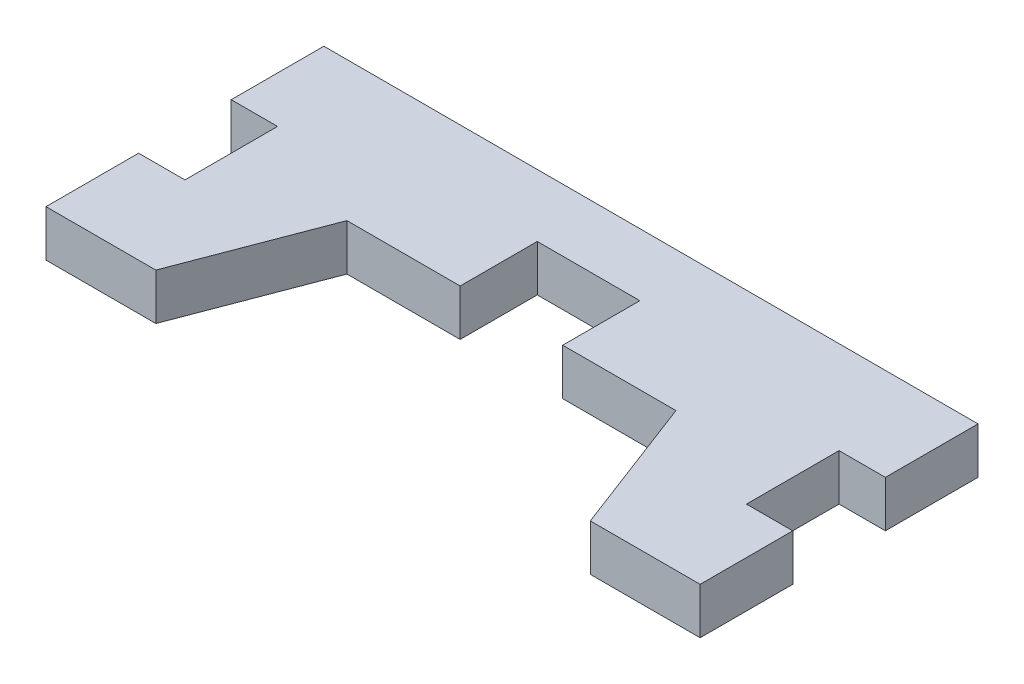
ISO-10303-21;
HEADER;
FILE_DESCRIPTION(('STEP AP214'),'2;1');
FILE_NAME('part.step','',(''),(''),'','','');
FILE_SCHEMA(('AUTOMOTIVE_DESIGN { 1 0 10303 214 1 1 1 1 }'));
ENDSEC;
DATA;
#1=APPLICATION_CONTEXT('core data for automotive mechanical design processes');
#2=APPLICATION_PROTOCOL_DEFINITION('international standard','automotive_design',2000,#1);
#3=PRODUCT_CONTEXT('',#1,'mechanical');
#4=PRODUCT('Part','Part','',(#3));
#5=PRODUCT_RELATED_PRODUCT_CATEGORY('part','',(#4));
#6=PRODUCT_DEFINITION_FORMATION('','',#4);
#7=PRODUCT_DEFINITION_CONTEXT('part definition',#1,'design');
#8=PRODUCT_DEFINITION('design','',#6,#7);
#9=PRODUCT_DEFINITION_SHAPE('','',#8);
#10=(LENGTH_UNIT() NAMED_UNIT(*) SI_UNIT(.MILLI.,.METRE.));
#11=(NAMED_UNIT(*) PLANE_ANGLE_UNIT() SI_UNIT($,.RADIAN.));
#12=(NAMED_UNIT(*) SI_UNIT($,.STERADIAN.) SOLID_ANGLE_UNIT());
#13=UNCERTAINTY_MEASURE_WITH_UNIT(LENGTH_MEASURE(1.E-05),#10,'distance_accuracy_value','');
#14=(GEOMETRIC_REPRESENTATION_CONTEXT(3) GLOBAL_UNCERTAINTY_ASSIGNED_CONTEXT((#13)) GLOBAL_UNIT_ASSIGNED_CONTEXT((#10,
#11,#12)) REPRESENTATION_CONTEXT('',''));
#15=CARTESIAN_POINT('',(0.,0.,0.));
#16=DIRECTION('',(0.,0.,1.));
#17=DIRECTION('',(1.,0.,0.));
#18=AXIS2_PLACEMENT_3D('',#15,#16,#17);
#19=CARTESIAN_POINT('',(25.5388964978911,6.,-1.12299862126056));
#20=DIRECTION('',(-0.934469694390437,0.,-0.356042680399194));
#21=DIRECTION('',(-0.356042680399194,0.,0.934469694390437));
#22=AXIS2_PLACEMENT_3D('',#19,#20,#21);
#23=PLANE('',#22);
#24=DIRECTION('',(0.356042680399194,0.,-0.934469694390437));
#25=VECTOR('',#24,1.);
#26=CARTESIAN_POINT('',(25.5388964978911,0.,-1.12299862126056));
#27=LINE('',#26,#25);
#28=CARTESIAN_POINT('',(18.7086114695798,0.,16.803768910793));
#29=VERTEX_POINT('',#28);
#30=CARTESIAN_POINT('',(25.5388964978911,0.,-1.12299862126056));
#31=VERTEX_POINT('',#30);
#32=EDGE_CURVE('E201',#29,#31,#27,.T.);
#33=ORIENTED_EDGE('',*,*,#32,.T.);
#34=DIRECTION('',(0.,-1.,0.));
#35=VECTOR('',#34,1.);
#36=CARTESIAN_POINT('',(25.5388964978911,6.,-1.12299862126056));
#37=LINE('',#36,#35);
#38=CARTESIAN_POINT('',(25.5388964978911,6.,-1.12299862126056));
#39=VERTEX_POINT('',#38);
#40=EDGE_CURVE('E11',#39,#31,#37,.T.);
#41=ORIENTED_EDGE('',*,*,#40,.F.);
#42=DIRECTION('',(0.356042680399194,0.,-0.934469694390437));
#43=VECTOR('',#42,1.);
#44=CARTESIAN_POINT('',(25.5388964978911,6.,-1.12299862126056));
#45=LINE('',#44,#43);
#46=CARTESIAN_POINT('',(18.7086114695798,6.,16.803768910793));
#47=VERTEX_POINT('',#46);
#48=EDGE_CURVE('E239',#47,#39,#45,.T.);
#49=ORIENTED_EDGE('',*,*,#48,.F.);
#50=DIRECTION('',(0.,-1.,0.));
#51=VECTOR('',#50,1.);
#52=CARTESIAN_POINT('',(18.7086114695798,6.,16.803768910793));
#53=LINE('',#52,#51);
#54=EDGE_CURVE('E197',#47,#29,#53,.T.);
#55=ORIENTED_EDGE('',*,*,#54,.T.);
#56=EDGE_LOOP('',(#33,#41,#49,#55));
#57=FACE_BOUND('',#56,.T.);
#58=ADVANCED_FACE('F33',(#57),#23,.F.);
#59=CARTESIAN_POINT('',(40.2068590818868,6.,-1.12299862126056));
#60=DIRECTION('',(0.,0.,-1.));
#61=DIRECTION('',(-1.,0.,0.));
#62=AXIS2_PLACEMENT_3D('',#59,#60,#61);
#63=PLANE('',#62);
#64=DIRECTION('',(1.,0.,0.));
#65=VECTOR('',#64,1.);
#66=CARTESIAN_POINT('',(40.2068590818868,0.,-1.12299862126056));
#67=LINE('',#66,#65);
#68=CARTESIAN_POINT('',(40.2068590818868,0.,-1.12299862126056));
#69=VERTEX_POINT('',#68);
#70=EDGE_CURVE('E204',#31,#69,#67,.T.);
#71=ORIENTED_EDGE('',*,*,#70,.T.);
#72=DIRECTION('',(0.,-1.,0.));
#73=VECTOR('',#72,1.);
#74=CARTESIAN_POINT('',(40.2068590818868,6.,-1.12299862126056));
#75=LINE('',#74,#73);
#76=CARTESIAN_POINT('',(40.2068590818868,6.,-1.12299862126056));
#77=VERTEX_POINT('',#76);
#78=EDGE_CURVE('E41',#77,#69,#75,.T.);
#79=ORIENTED_EDGE('',*,*,#78,.F.);
#80=DIRECTION('',(1.,0.,0.));
#81=VECTOR('',#80,1.);
#82=CARTESIAN_POINT('',(40.2068590818868,6.,-1.12299862126056));
#83=LINE('',#82,#81);
#84=EDGE_CURVE('E128',#39,#77,#83,.T.);
#85=ORIENTED_EDGE('',*,*,#84,.F.);
#86=ORIENTED_EDGE('',*,*,#40,.T.);
#87=EDGE_LOOP('',(#71,#79,#85,#86));
#88=FACE_BOUND('',#87,.T.);
#89=ADVANCED_FACE('F357',(#88),#63,.F.);
#90=CARTESIAN_POINT('',(40.2068590818868,6.,-1.12299862126056));
#91=DIRECTION('',(-1.,0.,0.));
#92=DIRECTION('',(0.,0.,1.));
#93=AXIS2_PLACEMENT_3D('',#90,#91,#92);
#94=PLANE('',#93);
#95=DIRECTION('',(0.,0.,-1.));
#96=VECTOR('',#95,1.);
#97=CARTESIAN_POINT('',(40.2068590818868,0.,-1.12299862126056));
#98=LINE('',#97,#96);
#99=CARTESIAN_POINT('',(40.2068590818868,0.,-11.1136068563082));
#100=VERTEX_POINT('',#99);
#101=EDGE_CURVE('E206',#69,#100,#98,.T.);
#102=ORIENTED_EDGE('',*,*,#101,.T.);
#103=DIRECTION('',(0.,-1.,0.));
#104=VECTOR('',#103,1.);
#105=CARTESIAN_POINT('',(40.2068590818868,6.,-11.1136068563082));
#106=LINE('',#105,#104);
#107=CARTESIAN_POINT('',(40.2068590818868,6.,-11.1136068563082));
#108=VERTEX_POINT('',#107);
#109=EDGE_CURVE('E282',#108,#100,#106,.T.);
#110=ORIENTED_EDGE('',*,*,#109,.F.);
#111=DIRECTION('',(0.,0.,-1.));
#112=VECTOR('',#111,1.);
#113=CARTESIAN_POINT('',(40.2068590818868,6.,-1.12299862126056));
#114=LINE('',#113,#112);
#115=EDGE_CURVE('E290',#77,#108,#114,.T.);
#116=ORIENTED_EDGE('',*,*,#115,.F.);
#117=ORIENTED_EDGE('',*,*,#78,.T.);
#118=EDGE_LOOP('',(#102,#110,#116,#117));
#119=FACE_BOUND('',#118,.T.);
#120=ADVANCED_FACE('F288',(#119),#94,.F.);
#121=CARTESIAN_POINT('',(40.2068590818868,6.,-11.1136068563082));
#122=DIRECTION('',(0.,0.,-1.));
#123=DIRECTION('',(-1.,0.,0.));
#124=AXIS2_PLACEMENT_3D('',#121,#122,#123);
#125=PLANE('',#124);
#126=DIRECTION('',(1.,0.,0.));
#127=VECTOR('',#126,1.);
#128=CARTESIAN_POINT('',(40.2068590818868,0.,-11.1136068563082));
#129=LINE('',#128,#127);
#130=CARTESIAN_POINT('',(53.4967784330314,0.,-11.1136068563082));
#131=VERTEX_POINT('',#130);
#132=EDGE_CURVE('E208',#100,#131,#129,.T.);
#133=ORIENTED_EDGE('',*,*,#132,.T.);
#134=DIRECTION('',(0.,-1.,0.));
#135=VECTOR('',#134,1.);
#136=CARTESIAN_POINT('',(53.4967784330314,6.,-11.1136068563082));
#137=LINE('',#136,#135);
#138=CARTESIAN_POINT('',(53.4967784330314,6.,-11.1136068563082));
#139=VERTEX_POINT('',#138);
#140=EDGE_CURVE('E279',#139,#131,#137,.T.);
#141=ORIENTED_EDGE('',*,*,#140,.F.);
#142=DIRECTION('',(1.,0.,0.));
#143=VECTOR('',#142,1.);
#144=CARTESIAN_POINT('',(40.2068590818868,6.,-11.1136068563082));
#145=LINE('',#144,#143);
#146=EDGE_CURVE('E308',#108,#139,#145,.T.);
#147=ORIENTED_EDGE('',*,*,#146,.F.);
#148=ORIENTED_EDGE('',*,*,#109,.T.);
#149=EDGE_LOOP('',(#133,#141,#147,#148));
#150=FACE_BOUND('',#149,.T.);
#151=ADVANCED_FACE('F299',(#150),#125,.F.);
#152=CARTESIAN_POINT('',(53.4967784330314,6.,-1.12299862126056));
#153=DIRECTION('',(1.,0.,0.));
#154=DIRECTION('',(0.,0.,-1.));
#155=AXIS2_PLACEMENT_3D('',#152,#153,#154);
#156=PLANE('',#155);
#157=DIRECTION('',(0.,0.,1.));
#158=VECTOR('',#157,1.);
#159=CARTESIAN_POINT('',(53.4967784330314,0.,-1.12299862126056));
#160=LINE('',#159,#158);
#161=CARTESIAN_POINT('',(53.4967784330314,0.,-1.12299862126056));
#162=VERTEX_POINT('',#161);
#163=EDGE_CURVE('E210',#131,#162,#160,.T.);
#164=ORIENTED_EDGE('',*,*,#163,.T.);
#165=DIRECTION('',(0.,-1.,0.));
#166=VECTOR('',#165,1.);
#167=CARTESIAN_POINT('',(53.4967784330314,6.,-1.12299862126056));
#168=LINE('',#167,#166);
#169=CARTESIAN_POINT('',(53.4967784330314,6.,-1.12299862126056));
#170=VERTEX_POINT('',#169);
#171=EDGE_CURVE('E276',#170,#162,#168,.T.);
#172=ORIENTED_EDGE('',*,*,#171,.F.);
#173=DIRECTION('',(0.,0.,1.));
#174=VECTOR('',#173,1.);
#175=CARTESIAN_POINT('',(53.4967784330314,6.,-1.12299862126056));
#176=LINE('',#175,#174);
#177=EDGE_CURVE('E305',#139,#170,#176,.T.);
#178=ORIENTED_EDGE('',*,*,#177,.F.);
#179=ORIENTED_EDGE('',*,*,#140,.T.);
#180=EDGE_LOOP('',(#164,#172,#178,#179));
#181=FACE_BOUND('',#180,.T.);
#182=ADVANCED_FACE('F303',(#181),#156,.F.);
#183=CARTESIAN_POINT('',(68.1647410170271,6.,-1.12299862126056));
#184=DIRECTION('',(0.,0.,-1.));
#185=DIRECTION('',(-1.,0.,0.));
#186=AXIS2_PLACEMENT_3D('',#183,#184,#185);
#187=PLANE('',#186);
#188=DIRECTION('',(1.,0.,0.));
#189=VECTOR('',#188,1.);
#190=CARTESIAN_POINT('',(68.1647410170271,0.,-1.12299862126056));
#191=LINE('',#190,#189);
#192=CARTESIAN_POINT('',(68.1647410170271,0.,-1.12299862126056));
#193=VERTEX_POINT('',#192);
#194=EDGE_CURVE('E212',#162,#193,#191,.T.);
#195=ORIENTED_EDGE('',*,*,#194,.T.);
#196=DIRECTION('',(0.,-1.,0.));
#197=VECTOR('',#196,1.);
#198=CARTESIAN_POINT('',(68.1647410170271,6.,-1.12299862126056));
#199=LINE('',#198,#197);
#200=CARTESIAN_POINT('',(68.1647410170271,6.,-1.12299862126056));
#201=VERTEX_POINT('',#200);
#202=EDGE_CURVE('E273',#201,#193,#199,.T.);
#203=ORIENTED_EDGE('',*,*,#202,.F.);
#204=DIRECTION('',(1.,0.,0.));
#205=VECTOR('',#204,1.);
#206=CARTESIAN_POINT('',(68.1647410170271,6.,-1.12299862126056));
#207=LINE('',#206,#205);
#208=EDGE_CURVE('E307',#170,#201,#207,.T.);
#209=ORIENTED_EDGE('',*,*,#208,.F.);
#210=ORIENTED_EDGE('',*,*,#171,.T.);
#211=EDGE_LOOP('',(#195,#203,#209,#210));
#212=FACE_BOUND('',#211,.T.);
#213=ADVANCED_FACE('F370',(#212),#187,.F.);
#214=CARTESIAN_POINT('',(74.9950260453383,6.,16.803768910793));
#215=DIRECTION('',(0.934469694390437,0.,-0.356042680399194));
#216=DIRECTION('',(-0.356042680399194,0.,-0.934469694390437));
#217=AXIS2_PLACEMENT_3D('',#214,#215,#216);
#218=PLANE('',#217);
#219=DIRECTION('',(0.356042680399194,0.,0.934469694390437));
#220=VECTOR('',#219,1.);
#221=CARTESIAN_POINT('',(74.9950260453383,0.,16.803768910793));
#222=LINE('',#221,#220);
#223=CARTESIAN_POINT('',(74.9950260453383,0.,16.803768910793));
#224=VERTEX_POINT('',#223);
#225=EDGE_CURVE('E214',#193,#224,#222,.T.);
#226=ORIENTED_EDGE('',*,*,#225,.T.);
#227=DIRECTION('',(0.,-1.,0.));
#228=VECTOR('',#227,1.);
#229=CARTESIAN_POINT('',(74.9950260453383,6.,16.803768910793));
#230=LINE('',#229,#228);
#231=CARTESIAN_POINT('',(74.9950260453383,6.,16.803768910793));
#232=VERTEX_POINT('',#231);
#233=EDGE_CURVE('E270',#232,#224,#230,.T.);
#234=ORIENTED_EDGE('',*,*,#233,.F.);
#235=DIRECTION('',(0.356042680399194,0.,0.934469694390437));
#236=VECTOR('',#235,1.);
#237=CARTESIAN_POINT('',(74.9950260453383,6.,16.803768910793));
#238=LINE('',#237,#236);
#239=EDGE_CURVE('E310',#201,#232,#238,.T.);
#240=ORIENTED_EDGE('',*,*,#239,.F.);
#241=ORIENTED_EDGE('',*,*,#202,.T.);
#242=EDGE_LOOP('',(#226,#234,#240,#241));
#243=FACE_BOUND('',#242,.T.);
#244=ADVANCED_FACE('F373',(#243),#218,.F.);
#245=CARTESIAN_POINT('',(89.2254004324591,6.,16.803768910793));
#246=DIRECTION('',(0.,0.,-1.));
#247=DIRECTION('',(-1.,0.,0.));
#248=AXIS2_PLACEMENT_3D('',#245,#246,#247);
#249=PLANE('',#248);
#250=DIRECTION('',(1.,0.,0.));
#251=VECTOR('',#250,1.);
#252=CARTESIAN_POINT('',(89.2254004324591,0.,16.803768910793));
#253=LINE('',#252,#251);
#254=CARTESIAN_POINT('',(89.2254004324591,0.,16.803768910793));
#255=VERTEX_POINT('',#254);
#256=EDGE_CURVE('E216',#224,#255,#253,.T.);
#257=ORIENTED_EDGE('',*,*,#256,.T.);
#258=DIRECTION('',(0.,-1.,0.));
#259=VECTOR('',#258,1.);
#260=CARTESIAN_POINT('',(89.2254004324591,6.,16.803768910793));
#261=LINE('',#260,#259);
#262=CARTESIAN_POINT('',(89.2254004324591,6.,16.803768910793));
#263=VERTEX_POINT('',#262);
#264=EDGE_CURVE('E267',#263,#255,#261,.T.);
#265=ORIENTED_EDGE('',*,*,#264,.F.);
#266=DIRECTION('',(1.,0.,0.));
#267=VECTOR('',#266,1.);
#268=CARTESIAN_POINT('',(89.2254004324591,6.,16.803768910793));
#269=LINE('',#268,#267);
#270=EDGE_CURVE('E316',#232,#263,#269,.T.);
#271=ORIENTED_EDGE('',*,*,#270,.F.);
#272=ORIENTED_EDGE('',*,*,#233,.T.);
#273=EDGE_LOOP('',(#257,#265,#271,#272));
#274=FACE_BOUND('',#273,.T.);
#275=ADVANCED_FACE('F377',(#274),#249,.F.);
#276=CARTESIAN_POINT('',(89.2254004324591,6.,4.80376891079302));
#277=DIRECTION('',(-1.,0.,0.));
#278=DIRECTION('',(0.,0.,1.));
#279=AXIS2_PLACEMENT_3D('',#276,#277,#278);
#280=PLANE('',#279);
#281=DIRECTION('',(0.,0.,-1.));
#282=VECTOR('',#281,1.);
#283=CARTESIAN_POINT('',(89.2254004324591,0.,4.80376891079302));
#284=LINE('',#283,#282);
#285=CARTESIAN_POINT('',(89.2254004324591,0.,4.80376891079302));
#286=VERTEX_POINT('',#285);
#287=EDGE_CURVE('E218',#255,#286,#284,.T.);
#288=ORIENTED_EDGE('',*,*,#287,.T.);
#289=DIRECTION('',(0.,-1.,0.));
#290=VECTOR('',#289,1.);
#291=CARTESIAN_POINT('',(89.2254004324591,6.,4.80376891079302));
#292=LINE('',#291,#290);
#293=CARTESIAN_POINT('',(89.2254004324591,6.,4.80376891079302));
#294=VERTEX_POINT('',#293);
#295=EDGE_CURVE('E264',#294,#286,#292,.T.);
#296=ORIENTED_EDGE('',*,*,#295,.F.);
#297=DIRECTION('',(0.,0.,-1.));
#298=VECTOR('',#297,1.);
#299=CARTESIAN_POINT('',(89.2254004324591,6.,4.80376891079302));
#300=LINE('',#299,#298);
#301=EDGE_CURVE('E318',#263,#294,#300,.T.);
#302=ORIENTED_EDGE('',*,*,#301,.F.);
#303=ORIENTED_EDGE('',*,*,#264,.T.);
#304=EDGE_LOOP('',(#288,#296,#302,#303));
#305=FACE_BOUND('',#304,.T.);
#306=ADVANCED_FACE('F381',(#305),#280,.F.);
#307=CARTESIAN_POINT('',(83.2254004324591,6.,4.80376891079302));
#308=DIRECTION('',(0.,0.,1.));
#309=DIRECTION('',(1.,0.,0.));
#310=AXIS2_PLACEMENT_3D('',#307,#308,#309);
#311=PLANE('',#310);
#312=DIRECTION('',(-1.,0.,0.));
#313=VECTOR('',#312,1.);
#314=CARTESIAN_POINT('',(83.2254004324591,0.,4.80376891079302));
#315=LINE('',#314,#313);
#316=CARTESIAN_POINT('',(83.2254004324591,0.,4.80376891079302));
#317=VERTEX_POINT('',#316);
#318=EDGE_CURVE('E220',#286,#317,#315,.T.);
#319=ORIENTED_EDGE('',*,*,#318,.T.);
#320=DIRECTION('',(0.,-1.,0.));
#321=VECTOR('',#320,1.);
#322=CARTESIAN_POINT('',(83.2254004324591,6.,4.80376891079302));
#323=LINE('',#322,#321);
#324=CARTESIAN_POINT('',(83.2254004324591,6.,4.80376891079302));
#325=VERTEX_POINT('',#324);
#326=EDGE_CURVE('E261',#325,#317,#323,.T.);
#327=ORIENTED_EDGE('',*,*,#326,.F.);
#328=DIRECTION('',(-1.,0.,0.));
#329=VECTOR('',#328,1.);
#330=CARTESIAN_POINT('',(83.2254004324591,6.,4.80376891079302));
#331=LINE('',#330,#329);
#332=EDGE_CURVE('E320',#294,#325,#331,.T.);
#333=ORIENTED_EDGE('',*,*,#332,.F.);
#334=ORIENTED_EDGE('',*,*,#295,.T.);
#335=EDGE_LOOP('',(#319,#327,#333,#334));
#336=FACE_BOUND('',#335,.T.);
#337=ADVANCED_FACE('F385',(#336),#311,.F.);
#338=CARTESIAN_POINT('',(83.2254004324591,6.,-7.19623108920698));
#339=DIRECTION('',(-1.,0.,0.));
#340=DIRECTION('',(0.,0.,1.));
#341=AXIS2_PLACEMENT_3D('',#338,#339,#340);
#342=PLANE('',#341);
#343=DIRECTION('',(0.,0.,-1.));
#344=VECTOR('',#343,1.);
#345=CARTESIAN_POINT('',(83.2254004324591,0.,-7.19623108920698));
#346=LINE('',#345,#344);
#347=CARTESIAN_POINT('',(83.2254004324591,0.,-7.19623108920698));
#348=VERTEX_POINT('',#347);
#349=EDGE_CURVE('E222',#317,#348,#346,.T.);
#350=ORIENTED_EDGE('',*,*,#349,.T.);
#351=DIRECTION('',(0.,-1.,0.));
#352=VECTOR('',#351,1.);
#353=CARTESIAN_POINT('',(83.2254004324591,6.,-7.19623108920698));
#354=LINE('',#353,#352);
#355=CARTESIAN_POINT('',(83.2254004324591,6.,-7.19623108920698));
#356=VERTEX_POINT('',#355);
#357=EDGE_CURVE('E258',#356,#348,#354,.T.);
#358=ORIENTED_EDGE('',*,*,#357,.F.);
#359=DIRECTION('',(0.,0.,-1.));
#360=VECTOR('',#359,1.);
#361=CARTESIAN_POINT('',(83.2254004324591,6.,-7.19623108920698));
#362=LINE('',#361,#360);
#363=EDGE_CURVE('E322',#325,#356,#362,.T.);
#364=ORIENTED_EDGE('',*,*,#363,.F.);
#365=ORIENTED_EDGE('',*,*,#326,.T.);
#366=EDGE_LOOP('',(#350,#358,#364,#365));
#367=FACE_BOUND('',#366,.T.);
#368=ADVANCED_FACE('F389',(#367),#342,.F.);
#369=CARTESIAN_POINT('',(89.2254004324591,6.,-7.19623108920698));
#370=DIRECTION('',(0.,0.,-1.));
#371=DIRECTION('',(-1.,0.,0.));
#372=AXIS2_PLACEMENT_3D('',#369,#370,#371);
#373=PLANE('',#372);
#374=DIRECTION('',(1.,0.,0.));
#375=VECTOR('',#374,1.);
#376=CARTESIAN_POINT('',(89.2254004324591,0.,-7.19623108920698));
#377=LINE('',#376,#375);
#378=CARTESIAN_POINT('',(89.2254004324591,0.,-7.19623108920698));
#379=VERTEX_POINT('',#378);
#380=EDGE_CURVE('E224',#348,#379,#377,.T.);
#381=ORIENTED_EDGE('',*,*,#380,.T.);
#382=DIRECTION('',(0.,-1.,0.));
#383=VECTOR('',#382,1.);
#384=CARTESIAN_POINT('',(89.2254004324591,6.,-7.19623108920698));
#385=LINE('',#384,#383);
#386=CARTESIAN_POINT('',(89.2254004324591,6.,-7.19623108920698));
#387=VERTEX_POINT('',#386);
#388=EDGE_CURVE('E255',#387,#379,#385,.T.);
#389=ORIENTED_EDGE('',*,*,#388,.F.);
#390=DIRECTION('',(1.,0.,0.));
#391=VECTOR('',#390,1.);
#392=CARTESIAN_POINT('',(89.2254004324591,6.,-7.19623108920698));
#393=LINE('',#392,#391);
#394=EDGE_CURVE('E324',#356,#387,#393,.T.);
#395=ORIENTED_EDGE('',*,*,#394,.F.);
#396=ORIENTED_EDGE('',*,*,#357,.T.);
#397=EDGE_LOOP('',(#381,#389,#395,#396));
#398=FACE_BOUND('',#397,.T.);
#399=ADVANCED_FACE('F393',(#398),#373,.F.);
#400=CARTESIAN_POINT('',(89.2254004324591,6.,-19.196231089207));
#401=DIRECTION('',(-1.,0.,0.));
#402=DIRECTION('',(0.,0.,1.));
#403=AXIS2_PLACEMENT_3D('',#400,#401,#402);
#404=PLANE('',#403);
#405=DIRECTION('',(0.,0.,-1.));
#406=VECTOR('',#405,1.);
#407=CARTESIAN_POINT('',(89.2254004324591,0.,-19.196231089207));
#408=LINE('',#407,#406);
#409=CARTESIAN_POINT('',(89.2254004324591,0.,-19.196231089207));
#410=VERTEX_POINT('',#409);
#411=EDGE_CURVE('E226',#379,#410,#408,.T.);
#412=ORIENTED_EDGE('',*,*,#411,.T.);
#413=DIRECTION('',(0.,-1.,0.));
#414=VECTOR('',#413,1.);
#415=CARTESIAN_POINT('',(89.2254004324591,6.,-19.196231089207));
#416=LINE('',#415,#414);
#417=CARTESIAN_POINT('',(89.2254004324591,6.,-19.196231089207));
#418=VERTEX_POINT('',#417);
#419=EDGE_CURVE('E252',#418,#410,#416,.T.);
#420=ORIENTED_EDGE('',*,*,#419,.F.);
#421=DIRECTION('',(0.,0.,-1.));
#422=VECTOR('',#421,1.);
#423=CARTESIAN_POINT('',(89.2254004324591,6.,-19.196231089207));
#424=LINE('',#423,#422);
#425=EDGE_CURVE('E326',#387,#418,#424,.T.);
#426=ORIENTED_EDGE('',*,*,#425,.F.);
#427=ORIENTED_EDGE('',*,*,#388,.T.);
#428=EDGE_LOOP('',(#412,#420,#426,#427));
#429=FACE_BOUND('',#428,.T.);
#430=ADVANCED_FACE('F397',(#429),#404,.F.);
#431=CARTESIAN_POINT('',(4.47823708245909,6.,-19.196231089207));
#432=DIRECTION('',(0.,0.,1.));
#433=DIRECTION('',(1.,0.,0.));
#434=AXIS2_PLACEMENT_3D('',#431,#432,#433);
#435=PLANE('',#434);
#436=DIRECTION('',(-1.,0.,0.));
#437=VECTOR('',#436,1.);
#438=CARTESIAN_POINT('',(4.47823708245909,0.,-19.196231089207));
#439=LINE('',#438,#437);
#440=CARTESIAN_POINT('',(4.47823708245909,0.,-19.196231089207));
#441=VERTEX_POINT('',#440);
#442=EDGE_CURVE('E228',#410,#441,#439,.T.);
#443=ORIENTED_EDGE('',*,*,#442,.T.);
#444=DIRECTION('',(0.,-1.,0.));
#445=VECTOR('',#444,1.);
#446=CARTESIAN_POINT('',(4.47823708245909,6.,-19.196231089207));
#447=LINE('',#446,#445);
#448=CARTESIAN_POINT('',(4.47823708245909,6.,-19.196231089207));
#449=VERTEX_POINT('',#448);
#450=EDGE_CURVE('E249',#449,#441,#447,.T.);
#451=ORIENTED_EDGE('',*,*,#450,.F.);
#452=DIRECTION('',(-1.,0.,0.));
#453=VECTOR('',#452,1.);
#454=CARTESIAN_POINT('',(4.47823708245909,6.,-19.196231089207));
#455=LINE('',#454,#453);
#456=EDGE_CURVE('E328',#418,#449,#455,.T.);
#457=ORIENTED_EDGE('',*,*,#456,.F.);
#458=ORIENTED_EDGE('',*,*,#419,.T.);
#459=EDGE_LOOP('',(#443,#451,#457,#458));
#460=FACE_BOUND('',#459,.T.);
#461=ADVANCED_FACE('F401',(#460),#435,.F.);
#462=CARTESIAN_POINT('',(4.47823708245909,6.,-7.19623108920698));
#463=DIRECTION('',(1.,0.,0.));
#464=DIRECTION('',(0.,0.,-1.));
#465=AXIS2_PLACEMENT_3D('',#462,#463,#464);
#466=PLANE('',#465);
#467=DIRECTION('',(0.,0.,1.));
#468=VECTOR('',#467,1.);
#469=CARTESIAN_POINT('',(4.47823708245909,0.,-7.19623108920698));
#470=LINE('',#469,#468);
#471=CARTESIAN_POINT('',(4.47823708245909,0.,-7.19623108920698));
#472=VERTEX_POINT('',#471);
#473=EDGE_CURVE('E230',#441,#472,#470,.T.);
#474=ORIENTED_EDGE('',*,*,#473,.T.);
#475=DIRECTION('',(0.,-1.,0.));
#476=VECTOR('',#475,1.);
#477=CARTESIAN_POINT('',(4.47823708245909,6.,-7.19623108920698));
#478=LINE('',#477,#476);
#479=CARTESIAN_POINT('',(4.47823708245909,6.,-7.19623108920698));
#480=VERTEX_POINT('',#479);
#481=EDGE_CURVE('E246',#480,#472,#478,.T.);
#482=ORIENTED_EDGE('',*,*,#481,.F.);
#483=DIRECTION('',(0.,0.,1.));
#484=VECTOR('',#483,1.);
#485=CARTESIAN_POINT('',(4.47823708245909,6.,-7.19623108920698));
#486=LINE('',#485,#484);
#487=EDGE_CURVE('E330',#449,#480,#486,.T.);
#488=ORIENTED_EDGE('',*,*,#487,.F.);
#489=ORIENTED_EDGE('',*,*,#450,.T.);
#490=EDGE_LOOP('',(#474,#482,#488,#489));
#491=FACE_BOUND('',#490,.T.);
#492=ADVANCED_FACE('F405',(#491),#466,.F.);
#493=CARTESIAN_POINT('',(10.4782370824591,6.,-7.19623108920698));
#494=DIRECTION('',(0.,0.,-1.));
#495=DIRECTION('',(-1.,0.,0.));
#496=AXIS2_PLACEMENT_3D('',#493,#494,#495);
#497=PLANE('',#496);
#498=DIRECTION('',(1.,0.,0.));
#499=VECTOR('',#498,1.);
#500=CARTESIAN_POINT('',(10.4782370824591,0.,-7.19623108920698));
#501=LINE('',#500,#499);
#502=CARTESIAN_POINT('',(10.4782370824591,0.,-7.19623108920698));
#503=VERTEX_POINT('',#502);
#504=EDGE_CURVE('E232',#472,#503,#501,.T.);
#505=ORIENTED_EDGE('',*,*,#504,.T.);
#506=DIRECTION('',(0.,-1.,0.));
#507=VECTOR('',#506,1.);
#508=CARTESIAN_POINT('',(10.4782370824591,6.,-7.19623108920698));
#509=LINE('',#508,#507);
#510=CARTESIAN_POINT('',(10.4782370824591,6.,-7.19623108920698));
#511=VERTEX_POINT('',#510);
#512=EDGE_CURVE('E243',#511,#503,#509,.T.);
#513=ORIENTED_EDGE('',*,*,#512,.F.);
#514=DIRECTION('',(1.,0.,0.));
#515=VECTOR('',#514,1.);
#516=CARTESIAN_POINT('',(10.4782370824591,6.,-7.19623108920698));
#517=LINE('',#516,#515);
#518=EDGE_CURVE('E332',#480,#511,#517,.T.);
#519=ORIENTED_EDGE('',*,*,#518,.F.);
#520=ORIENTED_EDGE('',*,*,#481,.T.);
#521=EDGE_LOOP('',(#505,#513,#519,#520));
#522=FACE_BOUND('',#521,.T.);
#523=ADVANCED_FACE('F338',(#522),#497,.F.);
#524=CARTESIAN_POINT('',(10.4782370824591,6.,4.80376891079302));
#525=DIRECTION('',(1.,0.,0.));
#526=DIRECTION('',(0.,0.,-1.));
#527=AXIS2_PLACEMENT_3D('',#524,#525,#526);
#528=PLANE('',#527);
#529=DIRECTION('',(0.,0.,1.));
#530=VECTOR('',#529,1.);
#531=CARTESIAN_POINT('',(10.4782370824591,0.,4.80376891079302));
#532=LINE('',#531,#530);
#533=CARTESIAN_POINT('',(10.4782370824591,0.,4.80376891079302));
#534=VERTEX_POINT('',#533);
#535=EDGE_CURVE('E234',#503,#534,#532,.T.);
#536=ORIENTED_EDGE('',*,*,#535,.T.);
#537=DIRECTION('',(0.,-1.,0.));
#538=VECTOR('',#537,1.);
#539=CARTESIAN_POINT('',(10.4782370824591,6.,4.80376891079302));
#540=LINE('',#539,#538);
#541=CARTESIAN_POINT('',(10.4782370824591,6.,4.80376891079302));
#542=VERTEX_POINT('',#541);
#543=EDGE_CURVE('E192',#542,#534,#540,.T.);
#544=ORIENTED_EDGE('',*,*,#543,.F.);
#545=DIRECTION('',(0.,0.,1.));
#546=VECTOR('',#545,1.);
#547=CARTESIAN_POINT('',(10.4782370824591,6.,4.80376891079302));
#548=LINE('',#547,#546);
#549=EDGE_CURVE('E183',#511,#542,#548,.T.);
#550=ORIENTED_EDGE('',*,*,#549,.F.);
#551=ORIENTED_EDGE('',*,*,#512,.T.);
#552=EDGE_LOOP('',(#536,#544,#550,#551));
#553=FACE_BOUND('',#552,.T.);
#554=ADVANCED_FACE('F342',(#553),#528,.F.);
#555=CARTESIAN_POINT('',(4.47823708245909,6.,4.80376891079302));
#556=DIRECTION('',(0.,0.,1.));
#557=DIRECTION('',(1.,0.,0.));
#558=AXIS2_PLACEMENT_3D('',#555,#556,#557);
#559=PLANE('',#558);
#560=DIRECTION('',(-1.,0.,0.));
#561=VECTOR('',#560,1.);
#562=CARTESIAN_POINT('',(4.47823708245909,0.,4.80376891079302));
#563=LINE('',#562,#561);
#564=CARTESIAN_POINT('',(4.47823708245909,0.,4.80376891079302));
#565=VERTEX_POINT('',#564);
#566=EDGE_CURVE('E191',#534,#565,#563,.T.);
#567=ORIENTED_EDGE('',*,*,#566,.T.);
#568=DIRECTION('',(0.,-1.,0.));
#569=VECTOR('',#568,1.);
#570=CARTESIAN_POINT('',(4.47823708245909,6.,4.80376891079302));
#571=LINE('',#570,#569);
#572=CARTESIAN_POINT('',(4.47823708245909,6.,4.80376891079302));
#573=VERTEX_POINT('',#572);
#574=EDGE_CURVE('E188',#573,#565,#571,.T.);
#575=ORIENTED_EDGE('',*,*,#574,.F.);
#576=DIRECTION('',(-1.,0.,0.));
#577=VECTOR('',#576,1.);
#578=CARTESIAN_POINT('',(4.47823708245909,6.,4.80376891079302));
#579=LINE('',#578,#577);
#580=EDGE_CURVE('E177',#542,#573,#579,.T.);
#581=ORIENTED_EDGE('',*,*,#580,.F.);
#582=ORIENTED_EDGE('',*,*,#543,.T.);
#583=EDGE_LOOP('',(#567,#575,#581,#582));
#584=FACE_BOUND('',#583,.T.);
#585=ADVANCED_FACE('F189',(#584),#559,.F.);
#586=CARTESIAN_POINT('',(4.47823708245909,6.,16.803768910793));
#587=DIRECTION('',(1.,0.,0.));
#588=DIRECTION('',(0.,0.,-1.));
#589=AXIS2_PLACEMENT_3D('',#586,#587,#588);
#590=PLANE('',#589);
#591=DIRECTION('',(0.,0.,1.));
#592=VECTOR('',#591,1.);
#593=CARTESIAN_POINT('',(4.47823708245909,0.,16.803768910793));
#594=LINE('',#593,#592);
#595=CARTESIAN_POINT('',(4.47823708245909,0.,16.803768910793));
#596=VERTEX_POINT('',#595);
#597=EDGE_CURVE('E114',#565,#596,#594,.T.);
#598=ORIENTED_EDGE('',*,*,#597,.T.);
#599=DIRECTION('',(0.,-1.,0.));
#600=VECTOR('',#599,1.);
#601=CARTESIAN_POINT('',(4.47823708245909,6.,16.803768910793));
#602=LINE('',#601,#600);
#603=CARTESIAN_POINT('',(4.47823708245909,6.,16.803768910793));
#604=VERTEX_POINT('',#603);
#605=EDGE_CURVE('E193',#604,#596,#602,.T.);
#606=ORIENTED_EDGE('',*,*,#605,.F.);
#607=DIRECTION('',(0.,0.,1.));
#608=VECTOR('',#607,1.);
#609=CARTESIAN_POINT('',(4.47823708245909,6.,16.803768910793));
#610=LINE('',#609,#608);
#611=EDGE_CURVE('E181',#573,#604,#610,.T.);
#612=ORIENTED_EDGE('',*,*,#611,.F.);
#613=ORIENTED_EDGE('',*,*,#574,.T.);
#614=EDGE_LOOP('',(#598,#606,#612,#613));
#615=FACE_BOUND('',#614,.T.);
#616=ADVANCED_FACE('F195',(#615),#590,.F.);
#617=CARTESIAN_POINT('',(18.7086114695798,6.,16.803768910793));
#618=DIRECTION('',(0.,0.,-1.));
#619=DIRECTION('',(-1.,0.,0.));
#620=AXIS2_PLACEMENT_3D('',#617,#618,#619);
#621=PLANE('',#620);
#622=DIRECTION('',(1.,0.,0.));
#623=VECTOR('',#622,1.);
#624=CARTESIAN_POINT('',(18.7086114695798,0.,16.803768910793));
#625=LINE('',#624,#623);
#626=EDGE_CURVE('E120',#596,#29,#625,.T.);
#627=ORIENTED_EDGE('',*,*,#626,.T.);
#628=ORIENTED_EDGE('',*,*,#54,.F.);
#629=DIRECTION('',(1.,0.,0.));
#630=VECTOR('',#629,1.);
#631=CARTESIAN_POINT('',(18.7086114695798,6.,16.803768910793));
#632=LINE('',#631,#630);
#633=EDGE_CURVE('E49',#604,#47,#632,.T.);
#634=ORIENTED_EDGE('',*,*,#633,.F.);
#635=ORIENTED_EDGE('',*,*,#605,.T.);
#636=EDGE_LOOP('',(#627,#628,#634,#635));
#637=FACE_BOUND('',#636,.T.);
#638=ADVANCED_FACE('F346',(#637),#621,.F.);
#639=CARTESIAN_POINT('',(0.,6.,0.));
#640=DIRECTION('',(0.,-1.,0.));
#641=DIRECTION('',(0.,0.,-1.));
#642=AXIS2_PLACEMENT_3D('',#639,#640,#641);
#643=PLANE('',#642);
#644=ORIENTED_EDGE('',*,*,#48,.T.);
#645=ORIENTED_EDGE('',*,*,#84,.T.);
#646=ORIENTED_EDGE('',*,*,#115,.T.);
#647=ORIENTED_EDGE('',*,*,#146,.T.);
#648=ORIENTED_EDGE('',*,*,#177,.T.);
#649=ORIENTED_EDGE('',*,*,#208,.T.);
#650=ORIENTED_EDGE('',*,*,#239,.T.);
#651=ORIENTED_EDGE('',*,*,#270,.T.);
#652=ORIENTED_EDGE('',*,*,#301,.T.);
#653=ORIENTED_EDGE('',*,*,#332,.T.);
#654=ORIENTED_EDGE('',*,*,#363,.T.);
#655=ORIENTED_EDGE('',*,*,#394,.T.);
#656=ORIENTED_EDGE('',*,*,#425,.T.);
#657=ORIENTED_EDGE('',*,*,#456,.T.);
#658=ORIENTED_EDGE('',*,*,#487,.T.);
#659=ORIENTED_EDGE('',*,*,#518,.T.);
#660=ORIENTED_EDGE('',*,*,#549,.T.);
#661=ORIENTED_EDGE('',*,*,#580,.T.);
#662=ORIENTED_EDGE('',*,*,#611,.T.);
#663=ORIENTED_EDGE('',*,*,#633,.T.);
#664=EDGE_LOOP('',(#644,#645,#646,#647,#648,#649,#650,#651,#652,#653,#654,#655,#656,#657,#658,
#659,#660,#661,#662,#663));
#665=FACE_BOUND('',#664,.T.);
#666=ADVANCED_FACE('F179',(#665),#643,.F.);
#667=CARTESIAN_POINT('',(0.,0.,0.));
#668=DIRECTION('',(0.,-1.,0.));
#669=DIRECTION('',(0.,0.,-1.));
#670=AXIS2_PLACEMENT_3D('',#667,#668,#669);
#671=PLANE('',#670);
#672=ORIENTED_EDGE('',*,*,#32,.F.);
#673=ORIENTED_EDGE('',*,*,#626,.F.);
#674=ORIENTED_EDGE('',*,*,#597,.F.);
#675=ORIENTED_EDGE('',*,*,#566,.F.);
#676=ORIENTED_EDGE('',*,*,#535,.F.);
#677=ORIENTED_EDGE('',*,*,#504,.F.);
#678=ORIENTED_EDGE('',*,*,#473,.F.);
#679=ORIENTED_EDGE('',*,*,#442,.F.);
#680=ORIENTED_EDGE('',*,*,#411,.F.);
#681=ORIENTED_EDGE('',*,*,#380,.F.);
#682=ORIENTED_EDGE('',*,*,#349,.F.);
#683=ORIENTED_EDGE('',*,*,#318,.F.);
#684=ORIENTED_EDGE('',*,*,#287,.F.);
#685=ORIENTED_EDGE('',*,*,#256,.F.);
#686=ORIENTED_EDGE('',*,*,#225,.F.);
#687=ORIENTED_EDGE('',*,*,#194,.F.);
#688=ORIENTED_EDGE('',*,*,#163,.F.);
#689=ORIENTED_EDGE('',*,*,#132,.F.);
#690=ORIENTED_EDGE('',*,*,#101,.F.);
#691=ORIENTED_EDGE('',*,*,#70,.F.);
#692=EDGE_LOOP('',(#672,#673,#674,#675,#676,#677,#678,#679,#680,#681,#682,#683,#684,#685,#686,
#687,#688,#689,#690,#691));
#693=FACE_BOUND('',#692,.T.);
#694=ADVANCED_FACE('F294',(#693),#671,.T.);
#695=CLOSED_SHELL('',(#58,#89,#120,#151,#182,#213,#244,#275,#306,#337,#368,#399,#430,#461,#492,
#523,#554,#585,#616,#638,#666,#694));
#696=MANIFOLD_SOLID_BREP('B2',#695);
#697=ADVANCED_BREP_SHAPE_REPRESENTATION('',(#18,#696),#14);
#698=SHAPE_DEFINITION_REPRESENTATION(#9,#697);
ENDSEC;
END-ISO-10303-21;
